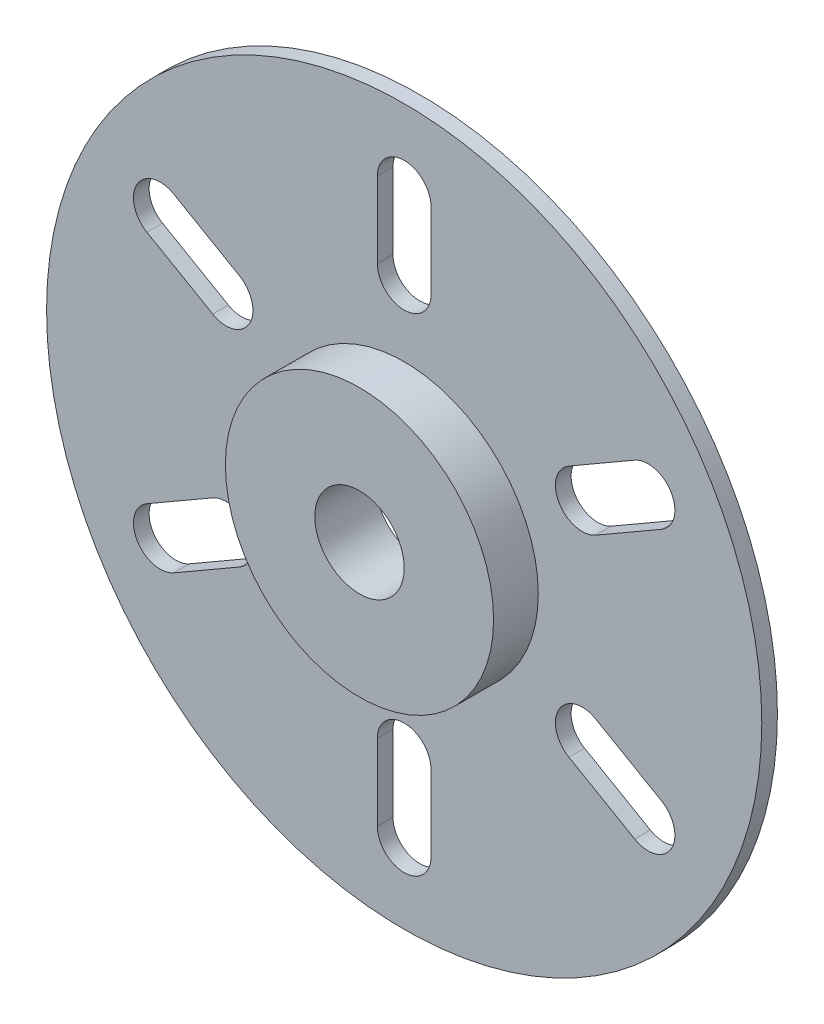
ISO-10303-21;
HEADER;
FILE_DESCRIPTION(('STEP AP214'),'2;1');
FILE_NAME('part.step','',(''),(''),'','','');
FILE_SCHEMA(('AUTOMOTIVE_DESIGN { 1 0 10303 214 1 1 1 1 }'));
ENDSEC;
DATA;
#1=APPLICATION_CONTEXT('core data for automotive mechanical design processes');
#2=APPLICATION_PROTOCOL_DEFINITION('international standard','automotive_design',2000,#1);
#3=PRODUCT_CONTEXT('',#1,'mechanical');
#4=PRODUCT('Part','Part','',(#3));
#5=PRODUCT_RELATED_PRODUCT_CATEGORY('part','',(#4));
#6=PRODUCT_DEFINITION_FORMATION('','',#4);
#7=PRODUCT_DEFINITION_CONTEXT('part definition',#1,'design');
#8=PRODUCT_DEFINITION('design','',#6,#7);
#9=PRODUCT_DEFINITION_SHAPE('','',#8);
#10=(LENGTH_UNIT() NAMED_UNIT(*) SI_UNIT(.MILLI.,.METRE.));
#11=(NAMED_UNIT(*) PLANE_ANGLE_UNIT() SI_UNIT($,.RADIAN.));
#12=(NAMED_UNIT(*) SI_UNIT($,.STERADIAN.) SOLID_ANGLE_UNIT());
#13=UNCERTAINTY_MEASURE_WITH_UNIT(LENGTH_MEASURE(1.E-05),#10,'distance_accuracy_value','');
#14=(GEOMETRIC_REPRESENTATION_CONTEXT(3) GLOBAL_UNCERTAINTY_ASSIGNED_CONTEXT((#13)) GLOBAL_UNIT_ASSIGNED_CONTEXT((#10,
#11,#12)) REPRESENTATION_CONTEXT('',''));
#15=CARTESIAN_POINT('',(0.,0.,0.));
#16=DIRECTION('',(0.,0.,1.));
#17=DIRECTION('',(1.,0.,0.));
#18=AXIS2_PLACEMENT_3D('',#15,#16,#17);
#19=CARTESIAN_POINT('',(0.,0.,3.5));
#20=DIRECTION('',(0.,0.,1.));
#21=DIRECTION('',(1.,0.,0.));
#22=AXIS2_PLACEMENT_3D('',#19,#20,#21);
#23=PLANE('',#22);
#24=CARTESIAN_POINT('',(0.,46.,3.5));
#25=DIRECTION('',(0.,0.,1.));
#26=DIRECTION('',(1.,0.,0.));
#27=AXIS2_PLACEMENT_3D('',#24,#25,#26);
#28=CIRCLE('',#27,6.);
#29=CARTESIAN_POINT('',(-6.,46.,3.5));
#30=VERTEX_POINT('',#29);
#31=CARTESIAN_POINT('',(6.,46.,3.5));
#32=VERTEX_POINT('',#31);
#33=EDGE_CURVE('E51',#30,#32,#28,.T.);
#34=ORIENTED_EDGE('',*,*,#33,.F.);
#35=DIRECTION('',(0.,-1.,0.));
#36=VECTOR('',#35,1.);
#37=CARTESIAN_POINT('',(-6.,46.,3.5));
#38=LINE('',#37,#36);
#39=CARTESIAN_POINT('',(-6.,63.,3.5));
#40=VERTEX_POINT('',#39);
#41=EDGE_CURVE('E340',#40,#30,#38,.T.);
#42=ORIENTED_EDGE('',*,*,#41,.F.);
#43=CARTESIAN_POINT('',(0.,63.,3.5));
#44=DIRECTION('',(0.,0.,1.));
#45=DIRECTION('',(1.,0.,0.));
#46=AXIS2_PLACEMENT_3D('',#43,#44,#45);
#47=CIRCLE('',#46,6.);
#48=CARTESIAN_POINT('',(6.,63.,3.5));
#49=VERTEX_POINT('',#48);
#50=EDGE_CURVE('E354',#49,#40,#47,.T.);
#51=ORIENTED_EDGE('',*,*,#50,.F.);
#52=DIRECTION('',(0.,1.,0.));
#53=VECTOR('',#52,1.);
#54=CARTESIAN_POINT('',(6.,46.,3.5));
#55=LINE('',#54,#53);
#56=EDGE_CURVE('E351',#32,#49,#55,.T.);
#57=ORIENTED_EDGE('',*,*,#56,.F.);
#58=EDGE_LOOP('',(#34,#42,#51,#57));
#59=FACE_BOUND('',#58,.T.);
#60=CARTESIAN_POINT('',(-39.8371685740842,22.9999999999999,3.5));
#61=DIRECTION('',(0.,0.,1.));
#62=DIRECTION('',(1.,0.,0.));
#63=AXIS2_PLACEMENT_3D('',#60,#61,#62);
#64=CIRCLE('',#63,6.);
#65=CARTESIAN_POINT('',(-42.8371685740842,17.8038475772933,3.5));
#66=VERTEX_POINT('',#65);
#67=CARTESIAN_POINT('',(-36.8371685740843,28.1961524227065,3.5));
#68=VERTEX_POINT('',#67);
#69=EDGE_CURVE('E59',#66,#68,#64,.T.);
#70=ORIENTED_EDGE('',*,*,#69,.F.);
#71=DIRECTION('',(0.86602540378444,-0.499999999999997,0.));
#72=VECTOR('',#71,1.);
#73=CARTESIAN_POINT('',(-42.8371685740842,17.8038475772933,3.5));
#74=LINE('',#73,#72);
#75=CARTESIAN_POINT('',(-57.5596004384197,26.3038475772932,3.5));
#76=VERTEX_POINT('',#75);
#77=EDGE_CURVE('E310',#76,#66,#74,.T.);
#78=ORIENTED_EDGE('',*,*,#77,.F.);
#79=CARTESIAN_POINT('',(-54.5596004384197,31.4999999999999,3.5));
#80=DIRECTION('',(0.,0.,1.));
#81=DIRECTION('',(1.,0.,0.));
#82=AXIS2_PLACEMENT_3D('',#79,#80,#81);
#83=CIRCLE('',#82,6.00000000000001);
#84=CARTESIAN_POINT('',(-51.5596004384197,36.6961524227065,3.5));
#85=VERTEX_POINT('',#84);
#86=EDGE_CURVE('E325',#85,#76,#83,.T.);
#87=ORIENTED_EDGE('',*,*,#86,.F.);
#88=DIRECTION('',(-0.866025403784439,0.499999999999999,0.));
#89=VECTOR('',#88,1.);
#90=CARTESIAN_POINT('',(-36.8371685740843,28.1961524227065,3.5));
#91=LINE('',#90,#89);
#92=EDGE_CURVE('E321',#68,#85,#91,.T.);
#93=ORIENTED_EDGE('',*,*,#92,.F.);
#94=EDGE_LOOP('',(#70,#78,#87,#93));
#95=FACE_BOUND('',#94,.T.);
#96=CARTESIAN_POINT('',(-39.8371685740841,-23.0000000000001,3.5));
#97=DIRECTION('',(0.,0.,1.));
#98=DIRECTION('',(1.,0.,0.));
#99=AXIS2_PLACEMENT_3D('',#96,#97,#98);
#100=CIRCLE('',#99,5.99999999999993);
#101=CARTESIAN_POINT('',(-36.8371685740841,-28.1961524227067,3.5));
#102=VERTEX_POINT('',#101);
#103=CARTESIAN_POINT('',(-42.8371685740841,-17.8038475772936,3.5));
#104=VERTEX_POINT('',#103);
#105=EDGE_CURVE('E288',#102,#104,#100,.T.);
#106=ORIENTED_EDGE('',*,*,#105,.F.);
#107=DIRECTION('',(0.866025403784437,0.500000000000003,0.));
#108=VECTOR('',#107,1.);
#109=CARTESIAN_POINT('',(-36.8371685740841,-28.1961524227067,3.5));
#110=LINE('',#109,#108);
#111=CARTESIAN_POINT('',(-51.5596004384195,-36.6961524227068,3.5));
#112=VERTEX_POINT('',#111);
#113=EDGE_CURVE('E278',#112,#102,#110,.T.);
#114=ORIENTED_EDGE('',*,*,#113,.F.);
#115=CARTESIAN_POINT('',(-54.5596004384196,-31.5000000000001,3.5));
#116=DIRECTION('',(0.,0.,1.));
#117=DIRECTION('',(1.,0.,0.));
#118=AXIS2_PLACEMENT_3D('',#115,#116,#117);
#119=CIRCLE('',#118,5.99999999999991);
#120=CARTESIAN_POINT('',(-57.5596004384195,-26.3038475772936,3.5));
#121=VERTEX_POINT('',#120);
#122=EDGE_CURVE('E294',#121,#112,#119,.T.);
#123=ORIENTED_EDGE('',*,*,#122,.F.);
#124=DIRECTION('',(-0.866025403784436,-0.500000000000004,0.));
#125=VECTOR('',#124,1.);
#126=CARTESIAN_POINT('',(-42.8371685740841,-17.8038475772936,3.5));
#127=LINE('',#126,#125);
#128=EDGE_CURVE('E290',#104,#121,#127,.T.);
#129=ORIENTED_EDGE('',*,*,#128,.F.);
#130=EDGE_LOOP('',(#106,#114,#123,#129));
#131=FACE_BOUND('',#130,.T.);
#132=CARTESIAN_POINT('',(0.,-46.,3.5));
#133=DIRECTION('',(0.,0.,1.));
#134=DIRECTION('',(1.,0.,0.));
#135=AXIS2_PLACEMENT_3D('',#132,#133,#134);
#136=CIRCLE('',#135,6.);
#137=CARTESIAN_POINT('',(6.00000000000001,-46.,3.5));
#138=VERTEX_POINT('',#137);
#139=CARTESIAN_POINT('',(-5.99999999999999,-46.,3.5));
#140=VERTEX_POINT('',#139);
#141=EDGE_CURVE('E256',#138,#140,#136,.T.);
#142=ORIENTED_EDGE('',*,*,#141,.F.);
#143=DIRECTION('',(0.,1.,0.));
#144=VECTOR('',#143,1.);
#145=CARTESIAN_POINT('',(6.00000000000001,-46.,3.5));
#146=LINE('',#145,#144);
#147=CARTESIAN_POINT('',(6.00000000000001,-63.,3.5));
#148=VERTEX_POINT('',#147);
#149=EDGE_CURVE('E246',#148,#138,#146,.T.);
#150=ORIENTED_EDGE('',*,*,#149,.F.);
#151=CARTESIAN_POINT('',(0.,-63.,3.5));
#152=DIRECTION('',(0.,0.,1.));
#153=DIRECTION('',(1.,0.,0.));
#154=AXIS2_PLACEMENT_3D('',#151,#152,#153);
#155=CIRCLE('',#154,6.);
#156=CARTESIAN_POINT('',(-5.99999999999999,-63.,3.5));
#157=VERTEX_POINT('',#156);
#158=EDGE_CURVE('E262',#157,#148,#155,.T.);
#159=ORIENTED_EDGE('',*,*,#158,.F.);
#160=DIRECTION('',(0.,-1.,0.));
#161=VECTOR('',#160,1.);
#162=CARTESIAN_POINT('',(-5.99999999999999,-46.,3.5));
#163=LINE('',#162,#161);
#164=EDGE_CURVE('E258',#140,#157,#163,.T.);
#165=ORIENTED_EDGE('',*,*,#164,.F.);
#166=EDGE_LOOP('',(#142,#150,#159,#165));
#167=FACE_BOUND('',#166,.T.);
#168=CARTESIAN_POINT('',(39.8371685740842,-22.9999999999999,3.5));
#169=DIRECTION('',(0.,0.,1.));
#170=DIRECTION('',(1.,0.,0.));
#171=AXIS2_PLACEMENT_3D('',#168,#169,#170);
#172=CIRCLE('',#171,6.00000000000001);
#173=CARTESIAN_POINT('',(42.8371685740842,-17.8038475772933,3.5));
#174=VERTEX_POINT('',#173);
#175=CARTESIAN_POINT('',(36.8371685740843,-28.1961524227065,3.5));
#176=VERTEX_POINT('',#175);
#177=EDGE_CURVE('E204',#174,#176,#172,.T.);
#178=ORIENTED_EDGE('',*,*,#177,.F.);
#179=DIRECTION('',(-0.86602540378444,0.499999999999998,0.));
#180=VECTOR('',#179,1.);
#181=CARTESIAN_POINT('',(42.8371685740842,-17.8038475772933,3.5));
#182=LINE('',#181,#180);
#183=CARTESIAN_POINT('',(57.5596004384197,-26.3038475772932,3.5));
#184=VERTEX_POINT('',#183);
#185=EDGE_CURVE('E222',#184,#174,#182,.T.);
#186=ORIENTED_EDGE('',*,*,#185,.F.);
#187=CARTESIAN_POINT('',(54.5596004384197,-31.4999999999999,3.5));
#188=DIRECTION('',(0.,0.,1.));
#189=DIRECTION('',(1.,0.,0.));
#190=AXIS2_PLACEMENT_3D('',#187,#188,#189);
#191=CIRCLE('',#190,6.);
#192=CARTESIAN_POINT('',(51.5596004384197,-36.6961524227065,3.5));
#193=VERTEX_POINT('',#192);
#194=EDGE_CURVE('E225',#193,#184,#191,.T.);
#195=ORIENTED_EDGE('',*,*,#194,.F.);
#196=DIRECTION('',(0.86602540378444,-0.499999999999997,0.));
#197=VECTOR('',#196,1.);
#198=CARTESIAN_POINT('',(36.8371685740843,-28.1961524227065,3.5));
#199=LINE('',#198,#197);
#200=EDGE_CURVE('E231',#176,#193,#199,.T.);
#201=ORIENTED_EDGE('',*,*,#200,.F.);
#202=EDGE_LOOP('',(#178,#186,#195,#201));
#203=FACE_BOUND('',#202,.T.);
#204=CARTESIAN_POINT('',(39.8371685740841,23.0000000000002,3.5));
#205=DIRECTION('',(0.,0.,1.));
#206=DIRECTION('',(1.,0.,0.));
#207=AXIS2_PLACEMENT_3D('',#204,#205,#206);
#208=CIRCLE('',#207,6.00000000000001);
#209=CARTESIAN_POINT('',(36.837168574084,28.1961524227068,3.5));
#210=VERTEX_POINT('',#209);
#211=CARTESIAN_POINT('',(42.8371685740841,17.8038475772936,3.5));
#212=VERTEX_POINT('',#211);
#213=EDGE_CURVE('E238',#210,#212,#208,.T.);
#214=ORIENTED_EDGE('',*,*,#213,.F.);
#215=DIRECTION('',(-0.866025403784436,-0.500000000000004,0.));
#216=VECTOR('',#215,1.);
#217=CARTESIAN_POINT('',(36.837168574084,28.1961524227068,3.5));
#218=LINE('',#217,#216);
#219=CARTESIAN_POINT('',(51.5596004384194,36.6961524227069,3.5));
#220=VERTEX_POINT('',#219);
#221=EDGE_CURVE('E369',#220,#210,#218,.T.);
#222=ORIENTED_EDGE('',*,*,#221,.F.);
#223=CARTESIAN_POINT('',(54.5596004384195,31.5000000000003,3.5));
#224=DIRECTION('',(0.,0.,1.));
#225=DIRECTION('',(1.,0.,0.));
#226=AXIS2_PLACEMENT_3D('',#223,#224,#225);
#227=CIRCLE('',#226,5.99999999999999);
#228=CARTESIAN_POINT('',(57.5596004384195,26.3038475772937,3.5));
#229=VERTEX_POINT('',#228);
#230=EDGE_CURVE('E383',#229,#220,#227,.T.);
#231=ORIENTED_EDGE('',*,*,#230,.F.);
#232=DIRECTION('',(0.866025403784436,0.500000000000005,0.));
#233=VECTOR('',#232,1.);
#234=CARTESIAN_POINT('',(42.8371685740841,17.8038475772936,3.5));
#235=LINE('',#234,#233);
#236=EDGE_CURVE('E380',#212,#229,#235,.T.);
#237=ORIENTED_EDGE('',*,*,#236,.F.);
#238=EDGE_LOOP('',(#214,#222,#231,#237));
#239=FACE_BOUND('',#238,.T.);
#240=CARTESIAN_POINT('',(0.,0.,3.5));
#241=DIRECTION('',(0.,0.,1.));
#242=DIRECTION('',(1.,0.,0.));
#243=AXIS2_PLACEMENT_3D('',#240,#241,#242);
#244=CIRCLE('',#243,80.);
#245=CARTESIAN_POINT('',(80.,0.,3.5));
#246=VERTEX_POINT('',#245);
#247=EDGE_CURVE('E11',#246,#246,#244,.T.);
#248=ORIENTED_EDGE('',*,*,#247,.T.);
#249=EDGE_LOOP('',(#248));
#250=FACE_BOUND('',#249,.T.);
#251=CARTESIAN_POINT('',(0.,0.,3.5));
#252=DIRECTION('',(0.,0.,1.));
#253=DIRECTION('',(1.,0.,0.));
#254=AXIS2_PLACEMENT_3D('',#251,#252,#253);
#255=CIRCLE('',#254,30.);
#256=CARTESIAN_POINT('',(30.,0.,3.5));
#257=VERTEX_POINT('',#256);
#258=EDGE_CURVE('E399',#257,#257,#255,.T.);
#259=ORIENTED_EDGE('',*,*,#258,.F.);
#260=EDGE_LOOP('',(#259));
#261=FACE_BOUND('',#260,.T.);
#262=ADVANCED_FACE('F36',(#59,#95,#131,#167,#203,#239,#250,#261),#23,.T.);
#263=CARTESIAN_POINT('',(0.,0.,3.5));
#264=DIRECTION('',(0.,0.,-1.));
#265=DIRECTION('',(-1.,0.,0.));
#266=AXIS2_PLACEMENT_3D('',#263,#264,#265);
#267=CYLINDRICAL_SURFACE('',#266,80.);
#268=ORIENTED_EDGE('',*,*,#247,.F.);
#269=EDGE_LOOP('',(#268));
#270=FACE_BOUND('',#269,.T.);
#271=CARTESIAN_POINT('',(0.,0.,0.));
#272=DIRECTION('',(0.,0.,1.));
#273=DIRECTION('',(1.,0.,0.));
#274=AXIS2_PLACEMENT_3D('',#271,#272,#273);
#275=CIRCLE('',#274,80.);
#276=CARTESIAN_POINT('',(80.,0.,0.));
#277=VERTEX_POINT('',#276);
#278=EDGE_CURVE('E40',#277,#277,#275,.T.);
#279=ORIENTED_EDGE('',*,*,#278,.T.);
#280=EDGE_LOOP('',(#279));
#281=FACE_BOUND('',#280,.T.);
#282=ADVANCED_FACE('F38',(#270,#281),#267,.T.);
#283=CARTESIAN_POINT('',(0.,0.,0.));
#284=DIRECTION('',(0.,0.,1.));
#285=DIRECTION('',(1.,0.,0.));
#286=AXIS2_PLACEMENT_3D('',#283,#284,#285);
#287=PLANE('',#286);
#288=DIRECTION('',(0.,-1.,0.));
#289=VECTOR('',#288,1.);
#290=CARTESIAN_POINT('',(-6.,46.,0.));
#291=LINE('',#290,#289);
#292=CARTESIAN_POINT('',(-6.,63.,0.));
#293=VERTEX_POINT('',#292);
#294=CARTESIAN_POINT('',(-6.,46.,0.));
#295=VERTEX_POINT('',#294);
#296=EDGE_CURVE('E346',#293,#295,#291,.T.);
#297=ORIENTED_EDGE('',*,*,#296,.T.);
#298=CARTESIAN_POINT('',(0.,46.,0.));
#299=DIRECTION('',(0.,0.,1.));
#300=DIRECTION('',(1.,0.,0.));
#301=AXIS2_PLACEMENT_3D('',#298,#299,#300);
#302=CIRCLE('',#301,6.);
#303=CARTESIAN_POINT('',(6.,46.,0.));
#304=VERTEX_POINT('',#303);
#305=EDGE_CURVE('E336',#295,#304,#302,.T.);
#306=ORIENTED_EDGE('',*,*,#305,.T.);
#307=DIRECTION('',(0.,1.,0.));
#308=VECTOR('',#307,1.);
#309=CARTESIAN_POINT('',(6.,46.,0.));
#310=LINE('',#309,#308);
#311=CARTESIAN_POINT('',(6.,63.,0.));
#312=VERTEX_POINT('',#311);
#313=EDGE_CURVE('E339',#304,#312,#310,.T.);
#314=ORIENTED_EDGE('',*,*,#313,.T.);
#315=CARTESIAN_POINT('',(0.,63.,0.));
#316=DIRECTION('',(0.,0.,1.));
#317=DIRECTION('',(1.,0.,0.));
#318=AXIS2_PLACEMENT_3D('',#315,#316,#317);
#319=CIRCLE('',#318,6.);
#320=EDGE_CURVE('E343',#312,#293,#319,.T.);
#321=ORIENTED_EDGE('',*,*,#320,.T.);
#322=EDGE_LOOP('',(#297,#306,#314,#321));
#323=FACE_BOUND('',#322,.T.);
#324=DIRECTION('',(0.86602540378444,-0.499999999999997,0.));
#325=VECTOR('',#324,1.);
#326=CARTESIAN_POINT('',(-42.8371685740842,17.8038475772933,0.));
#327=LINE('',#326,#325);
#328=CARTESIAN_POINT('',(-57.5596004384197,26.3038475772932,0.));
#329=VERTEX_POINT('',#328);
#330=CARTESIAN_POINT('',(-42.8371685740842,17.8038475772933,0.));
#331=VERTEX_POINT('',#330);
#332=EDGE_CURVE('E316',#329,#331,#327,.T.);
#333=ORIENTED_EDGE('',*,*,#332,.T.);
#334=CARTESIAN_POINT('',(-39.8371685740842,22.9999999999999,0.));
#335=DIRECTION('',(0.,0.,1.));
#336=DIRECTION('',(1.,0.,0.));
#337=AXIS2_PLACEMENT_3D('',#334,#335,#336);
#338=CIRCLE('',#337,6.);
#339=CARTESIAN_POINT('',(-36.8371685740843,28.1961524227065,0.));
#340=VERTEX_POINT('',#339);
#341=EDGE_CURVE('E306',#331,#340,#338,.T.);
#342=ORIENTED_EDGE('',*,*,#341,.T.);
#343=DIRECTION('',(-0.866025403784439,0.499999999999999,0.));
#344=VECTOR('',#343,1.);
#345=CARTESIAN_POINT('',(-36.8371685740843,28.1961524227065,0.));
#346=LINE('',#345,#344);
#347=CARTESIAN_POINT('',(-51.5596004384197,36.6961524227065,0.));
#348=VERTEX_POINT('',#347);
#349=EDGE_CURVE('E309',#340,#348,#346,.T.);
#350=ORIENTED_EDGE('',*,*,#349,.T.);
#351=CARTESIAN_POINT('',(-54.5596004384197,31.4999999999999,0.));
#352=DIRECTION('',(0.,0.,1.));
#353=DIRECTION('',(1.,0.,0.));
#354=AXIS2_PLACEMENT_3D('',#351,#352,#353);
#355=CIRCLE('',#354,6.00000000000001);
#356=EDGE_CURVE('E313',#348,#329,#355,.T.);
#357=ORIENTED_EDGE('',*,*,#356,.T.);
#358=EDGE_LOOP('',(#333,#342,#350,#357));
#359=FACE_BOUND('',#358,.T.);
#360=DIRECTION('',(0.866025403784437,0.500000000000003,0.));
#361=VECTOR('',#360,1.);
#362=CARTESIAN_POINT('',(-36.8371685740841,-28.1961524227067,0.));
#363=LINE('',#362,#361);
#364=CARTESIAN_POINT('',(-51.5596004384195,-36.6961524227068,0.));
#365=VERTEX_POINT('',#364);
#366=CARTESIAN_POINT('',(-36.8371685740841,-28.1961524227067,0.));
#367=VERTEX_POINT('',#366);
#368=EDGE_CURVE('E284',#365,#367,#363,.T.);
#369=ORIENTED_EDGE('',*,*,#368,.T.);
#370=CARTESIAN_POINT('',(-39.8371685740841,-23.0000000000001,0.));
#371=DIRECTION('',(0.,0.,1.));
#372=DIRECTION('',(1.,0.,0.));
#373=AXIS2_PLACEMENT_3D('',#370,#371,#372);
#374=CIRCLE('',#373,5.99999999999993);
#375=CARTESIAN_POINT('',(-42.8371685740841,-17.8038475772936,0.));
#376=VERTEX_POINT('',#375);
#377=EDGE_CURVE('E274',#367,#376,#374,.T.);
#378=ORIENTED_EDGE('',*,*,#377,.T.);
#379=DIRECTION('',(-0.866025403784436,-0.500000000000004,0.));
#380=VECTOR('',#379,1.);
#381=CARTESIAN_POINT('',(-42.8371685740841,-17.8038475772936,0.));
#382=LINE('',#381,#380);
#383=CARTESIAN_POINT('',(-57.5596004384195,-26.3038475772937,0.));
#384=VERTEX_POINT('',#383);
#385=EDGE_CURVE('E277',#376,#384,#382,.T.);
#386=ORIENTED_EDGE('',*,*,#385,.T.);
#387=CARTESIAN_POINT('',(-54.5596004384196,-31.5000000000001,0.));
#388=DIRECTION('',(0.,0.,1.));
#389=DIRECTION('',(1.,0.,0.));
#390=AXIS2_PLACEMENT_3D('',#387,#388,#389);
#391=CIRCLE('',#390,5.99999999999991);
#392=EDGE_CURVE('E281',#384,#365,#391,.T.);
#393=ORIENTED_EDGE('',*,*,#392,.T.);
#394=EDGE_LOOP('',(#369,#378,#386,#393));
#395=FACE_BOUND('',#394,.T.);
#396=DIRECTION('',(0.,1.,0.));
#397=VECTOR('',#396,1.);
#398=CARTESIAN_POINT('',(6.00000000000001,-46.,0.));
#399=LINE('',#398,#397);
#400=CARTESIAN_POINT('',(6.00000000000001,-63.,0.));
#401=VERTEX_POINT('',#400);
#402=CARTESIAN_POINT('',(6.00000000000001,-46.,0.));
#403=VERTEX_POINT('',#402);
#404=EDGE_CURVE('E252',#401,#403,#399,.T.);
#405=ORIENTED_EDGE('',*,*,#404,.T.);
#406=CARTESIAN_POINT('',(0.,-46.,0.));
#407=DIRECTION('',(0.,0.,1.));
#408=DIRECTION('',(1.,0.,0.));
#409=AXIS2_PLACEMENT_3D('',#406,#407,#408);
#410=CIRCLE('',#409,6.);
#411=CARTESIAN_POINT('',(-5.99999999999999,-46.,0.));
#412=VERTEX_POINT('',#411);
#413=EDGE_CURVE('E242',#403,#412,#410,.T.);
#414=ORIENTED_EDGE('',*,*,#413,.T.);
#415=DIRECTION('',(0.,-1.,0.));
#416=VECTOR('',#415,1.);
#417=CARTESIAN_POINT('',(-5.99999999999999,-46.,0.));
#418=LINE('',#417,#416);
#419=CARTESIAN_POINT('',(-5.99999999999999,-63.,0.));
#420=VERTEX_POINT('',#419);
#421=EDGE_CURVE('E245',#412,#420,#418,.T.);
#422=ORIENTED_EDGE('',*,*,#421,.T.);
#423=CARTESIAN_POINT('',(0.,-63.,0.));
#424=DIRECTION('',(0.,0.,1.));
#425=DIRECTION('',(1.,0.,0.));
#426=AXIS2_PLACEMENT_3D('',#423,#424,#425);
#427=CIRCLE('',#426,6.);
#428=EDGE_CURVE('E249',#420,#401,#427,.T.);
#429=ORIENTED_EDGE('',*,*,#428,.T.);
#430=EDGE_LOOP('',(#405,#414,#422,#429));
#431=FACE_BOUND('',#430,.T.);
#432=DIRECTION('',(-0.86602540378444,0.499999999999998,0.));
#433=VECTOR('',#432,1.);
#434=CARTESIAN_POINT('',(42.8371685740842,-17.8038475772933,0.));
#435=LINE('',#434,#433);
#436=CARTESIAN_POINT('',(57.5596004384197,-26.3038475772932,0.));
#437=VERTEX_POINT('',#436);
#438=CARTESIAN_POINT('',(42.8371685740842,-17.8038475772933,0.));
#439=VERTEX_POINT('',#438);
#440=EDGE_CURVE('E209',#437,#439,#435,.T.);
#441=ORIENTED_EDGE('',*,*,#440,.T.);
#442=CARTESIAN_POINT('',(39.8371685740842,-22.9999999999999,0.));
#443=DIRECTION('',(0.,0.,1.));
#444=DIRECTION('',(1.,0.,0.));
#445=AXIS2_PLACEMENT_3D('',#442,#443,#444);
#446=CIRCLE('',#445,6.00000000000001);
#447=CARTESIAN_POINT('',(36.8371685740843,-28.1961524227065,0.));
#448=VERTEX_POINT('',#447);
#449=EDGE_CURVE('E201',#439,#448,#446,.T.);
#450=ORIENTED_EDGE('',*,*,#449,.T.);
#451=DIRECTION('',(0.86602540378444,-0.499999999999997,0.));
#452=VECTOR('',#451,1.);
#453=CARTESIAN_POINT('',(36.8371685740843,-28.1961524227065,0.));
#454=LINE('',#453,#452);
#455=CARTESIAN_POINT('',(51.5596004384198,-36.6961524227065,0.));
#456=VERTEX_POINT('',#455);
#457=EDGE_CURVE('E213',#448,#456,#454,.T.);
#458=ORIENTED_EDGE('',*,*,#457,.T.);
#459=CARTESIAN_POINT('',(54.5596004384197,-31.4999999999999,0.));
#460=DIRECTION('',(0.,0.,1.));
#461=DIRECTION('',(1.,0.,0.));
#462=AXIS2_PLACEMENT_3D('',#459,#460,#461);
#463=CIRCLE('',#462,6.);
#464=EDGE_CURVE('E217',#456,#437,#463,.T.);
#465=ORIENTED_EDGE('',*,*,#464,.T.);
#466=EDGE_LOOP('',(#441,#450,#458,#465));
#467=FACE_BOUND('',#466,.T.);
#468=DIRECTION('',(-0.866025403784436,-0.500000000000004,0.));
#469=VECTOR('',#468,1.);
#470=CARTESIAN_POINT('',(36.837168574084,28.1961524227068,0.));
#471=LINE('',#470,#469);
#472=CARTESIAN_POINT('',(51.5596004384194,36.6961524227069,0.));
#473=VERTEX_POINT('',#472);
#474=CARTESIAN_POINT('',(36.837168574084,28.1961524227068,0.));
#475=VERTEX_POINT('',#474);
#476=EDGE_CURVE('E375',#473,#475,#471,.T.);
#477=ORIENTED_EDGE('',*,*,#476,.T.);
#478=CARTESIAN_POINT('',(39.8371685740841,23.0000000000002,0.));
#479=DIRECTION('',(0.,0.,1.));
#480=DIRECTION('',(1.,0.,0.));
#481=AXIS2_PLACEMENT_3D('',#478,#479,#480);
#482=CIRCLE('',#481,6.00000000000001);
#483=CARTESIAN_POINT('',(42.8371685740841,17.8038475772936,0.));
#484=VERTEX_POINT('',#483);
#485=EDGE_CURVE('E365',#475,#484,#482,.T.);
#486=ORIENTED_EDGE('',*,*,#485,.T.);
#487=DIRECTION('',(0.866025403784436,0.500000000000005,0.));
#488=VECTOR('',#487,1.);
#489=CARTESIAN_POINT('',(42.8371685740841,17.8038475772936,0.));
#490=LINE('',#489,#488);
#491=CARTESIAN_POINT('',(57.5596004384195,26.3038475772937,0.));
#492=VERTEX_POINT('',#491);
#493=EDGE_CURVE('E368',#484,#492,#490,.T.);
#494=ORIENTED_EDGE('',*,*,#493,.T.);
#495=CARTESIAN_POINT('',(54.5596004384195,31.5000000000003,0.));
#496=DIRECTION('',(0.,0.,1.));
#497=DIRECTION('',(1.,0.,0.));
#498=AXIS2_PLACEMENT_3D('',#495,#496,#497);
#499=CIRCLE('',#498,5.99999999999999);
#500=EDGE_CURVE('E372',#492,#473,#499,.T.);
#501=ORIENTED_EDGE('',*,*,#500,.T.);
#502=EDGE_LOOP('',(#477,#486,#494,#501));
#503=FACE_BOUND('',#502,.T.);
#504=CARTESIAN_POINT('',(0.,0.,0.));
#505=DIRECTION('',(0.,0.,1.));
#506=DIRECTION('',(1.,0.,0.));
#507=AXIS2_PLACEMENT_3D('',#504,#505,#506);
#508=CIRCLE('',#507,10.);
#509=CARTESIAN_POINT('',(10.,0.,0.));
#510=VERTEX_POINT('',#509);
#511=EDGE_CURVE('E403',#510,#510,#508,.T.);
#512=ORIENTED_EDGE('',*,*,#511,.T.);
#513=EDGE_LOOP('',(#512));
#514=FACE_BOUND('',#513,.T.);
#515=ORIENTED_EDGE('',*,*,#278,.F.);
#516=EDGE_LOOP('',(#515));
#517=FACE_BOUND('',#516,.T.);
#518=ADVANCED_FACE('F219',(#323,#359,#395,#431,#467,#503,#514,#517),#287,.F.);
#519=CARTESIAN_POINT('',(0.,0.,0.));
#520=DIRECTION('',(0.,0.,1.));
#521=DIRECTION('',(1.,0.,0.));
#522=AXIS2_PLACEMENT_3D('',#519,#520,#521);
#523=CYLINDRICAL_SURFACE('',#522,10.);
#524=ORIENTED_EDGE('',*,*,#511,.F.);
#525=EDGE_LOOP('',(#524));
#526=FACE_BOUND('',#525,.T.);
#527=CARTESIAN_POINT('',(0.,0.,13.5));
#528=DIRECTION('',(0.,0.,1.));
#529=DIRECTION('',(1.,0.,0.));
#530=AXIS2_PLACEMENT_3D('',#527,#528,#529);
#531=CIRCLE('',#530,10.);
#532=CARTESIAN_POINT('',(10.,0.,13.5));
#533=VERTEX_POINT('',#532);
#534=EDGE_CURVE('E390',#533,#533,#531,.T.);
#535=ORIENTED_EDGE('',*,*,#534,.T.);
#536=EDGE_LOOP('',(#535));
#537=FACE_BOUND('',#536,.T.);
#538=ADVANCED_FACE('F414',(#526,#537),#523,.F.);
#539=CARTESIAN_POINT('',(0.,0.,13.5));
#540=DIRECTION('',(0.,0.,1.));
#541=DIRECTION('',(1.,0.,0.));
#542=AXIS2_PLACEMENT_3D('',#539,#540,#541);
#543=PLANE('',#542);
#544=CARTESIAN_POINT('',(0.,0.,13.5));
#545=DIRECTION('',(0.,0.,1.));
#546=DIRECTION('',(1.,0.,0.));
#547=AXIS2_PLACEMENT_3D('',#544,#545,#546);
#548=CIRCLE('',#547,30.);
#549=CARTESIAN_POINT('',(30.,0.,13.5));
#550=VERTEX_POINT('',#549);
#551=EDGE_CURVE('E400',#550,#550,#548,.T.);
#552=ORIENTED_EDGE('',*,*,#551,.T.);
#553=EDGE_LOOP('',(#552));
#554=FACE_BOUND('',#553,.T.);
#555=ORIENTED_EDGE('',*,*,#534,.F.);
#556=EDGE_LOOP('',(#555));
#557=FACE_BOUND('',#556,.T.);
#558=ADVANCED_FACE('F420',(#554,#557),#543,.T.);
#559=CARTESIAN_POINT('',(0.,0.,13.5));
#560=DIRECTION('',(0.,0.,-1.));
#561=DIRECTION('',(-1.,0.,0.));
#562=AXIS2_PLACEMENT_3D('',#559,#560,#561);
#563=CYLINDRICAL_SURFACE('',#562,30.);
#564=ORIENTED_EDGE('',*,*,#551,.F.);
#565=EDGE_LOOP('',(#564));
#566=FACE_BOUND('',#565,.T.);
#567=ORIENTED_EDGE('',*,*,#258,.T.);
#568=EDGE_LOOP('',(#567));
#569=FACE_BOUND('',#568,.T.);
#570=ADVANCED_FACE('F432',(#566,#569),#563,.T.);
#571=CARTESIAN_POINT('',(39.8371685740841,23.0000000000002,0.));
#572=DIRECTION('',(0.,0.,1.));
#573=DIRECTION('',(1.,0.,0.));
#574=AXIS2_PLACEMENT_3D('',#571,#572,#573);
#575=CYLINDRICAL_SURFACE('',#574,6.00000000000001);
#576=ORIENTED_EDGE('',*,*,#213,.T.);
#577=DIRECTION('',(0.,0.,1.));
#578=VECTOR('',#577,1.);
#579=CARTESIAN_POINT('',(42.8371685740841,17.8038475772936,0.));
#580=LINE('',#579,#578);
#581=EDGE_CURVE('E378',#484,#212,#580,.T.);
#582=ORIENTED_EDGE('',*,*,#581,.F.);
#583=ORIENTED_EDGE('',*,*,#485,.F.);
#584=DIRECTION('',(0.,0.,1.));
#585=VECTOR('',#584,1.);
#586=CARTESIAN_POINT('',(36.837168574084,28.1961524227068,0.));
#587=LINE('',#586,#585);
#588=EDGE_CURVE('E388',#475,#210,#587,.T.);
#589=ORIENTED_EDGE('',*,*,#588,.T.);
#590=EDGE_LOOP('',(#576,#582,#583,#589));
#591=FACE_BOUND('',#590,.T.);
#592=ADVANCED_FACE('F435',(#591),#575,.F.);
#593=CARTESIAN_POINT('',(36.837168574084,28.1961524227068,0.));
#594=DIRECTION('',(-0.500000000000004,0.866025403784436,0.));
#595=DIRECTION('',(-0.866025403784436,-0.500000000000004,0.));
#596=AXIS2_PLACEMENT_3D('',#593,#594,#595);
#597=PLANE('',#596);
#598=ORIENTED_EDGE('',*,*,#221,.T.);
#599=ORIENTED_EDGE('',*,*,#588,.F.);
#600=ORIENTED_EDGE('',*,*,#476,.F.);
#601=DIRECTION('',(0.,0.,1.));
#602=VECTOR('',#601,1.);
#603=CARTESIAN_POINT('',(51.5596004384194,36.6961524227069,0.));
#604=LINE('',#603,#602);
#605=EDGE_CURVE('E391',#473,#220,#604,.T.);
#606=ORIENTED_EDGE('',*,*,#605,.T.);
#607=EDGE_LOOP('',(#598,#599,#600,#606));
#608=FACE_BOUND('',#607,.T.);
#609=ADVANCED_FACE('F442',(#608),#597,.F.);
#610=CARTESIAN_POINT('',(54.5596004384195,31.5000000000003,0.));
#611=DIRECTION('',(0.,0.,1.));
#612=DIRECTION('',(1.,0.,0.));
#613=AXIS2_PLACEMENT_3D('',#610,#611,#612);
#614=CYLINDRICAL_SURFACE('',#613,5.99999999999999);
#615=ORIENTED_EDGE('',*,*,#230,.T.);
#616=ORIENTED_EDGE('',*,*,#605,.F.);
#617=ORIENTED_EDGE('',*,*,#500,.F.);
#618=DIRECTION('',(0.,0.,1.));
#619=VECTOR('',#618,1.);
#620=CARTESIAN_POINT('',(57.5596004384195,26.3038475772937,0.));
#621=LINE('',#620,#619);
#622=EDGE_CURVE('E393',#492,#229,#621,.T.);
#623=ORIENTED_EDGE('',*,*,#622,.T.);
#624=EDGE_LOOP('',(#615,#616,#617,#623));
#625=FACE_BOUND('',#624,.T.);
#626=ADVANCED_FACE('F447',(#625),#614,.F.);
#627=CARTESIAN_POINT('',(42.8371685740841,17.8038475772936,0.));
#628=DIRECTION('',(0.500000000000005,-0.866025403784435,0.));
#629=DIRECTION('',(0.866025403784436,0.500000000000005,0.));
#630=AXIS2_PLACEMENT_3D('',#627,#628,#629);
#631=PLANE('',#630);
#632=ORIENTED_EDGE('',*,*,#236,.T.);
#633=ORIENTED_EDGE('',*,*,#622,.F.);
#634=ORIENTED_EDGE('',*,*,#493,.F.);
#635=ORIENTED_EDGE('',*,*,#581,.T.);
#636=EDGE_LOOP('',(#632,#633,#634,#635));
#637=FACE_BOUND('',#636,.T.);
#638=ADVANCED_FACE('F444',(#637),#631,.F.);
#639=CARTESIAN_POINT('',(39.8371685740842,-22.9999999999999,0.));
#640=DIRECTION('',(0.,0.,1.));
#641=DIRECTION('',(1.,0.,0.));
#642=AXIS2_PLACEMENT_3D('',#639,#640,#641);
#643=CYLINDRICAL_SURFACE('',#642,6.00000000000001);
#644=ORIENTED_EDGE('',*,*,#177,.T.);
#645=DIRECTION('',(0.,0.,1.));
#646=VECTOR('',#645,1.);
#647=CARTESIAN_POINT('',(36.8371685740843,-28.1961524227065,0.));
#648=LINE('',#647,#646);
#649=EDGE_CURVE('E197',#448,#176,#648,.T.);
#650=ORIENTED_EDGE('',*,*,#649,.F.);
#651=ORIENTED_EDGE('',*,*,#449,.F.);
#652=DIRECTION('',(0.,0.,1.));
#653=VECTOR('',#652,1.);
#654=CARTESIAN_POINT('',(42.8371685740842,-17.8038475772933,0.));
#655=LINE('',#654,#653);
#656=EDGE_CURVE('E236',#439,#174,#655,.T.);
#657=ORIENTED_EDGE('',*,*,#656,.T.);
#658=EDGE_LOOP('',(#644,#650,#651,#657));
#659=FACE_BOUND('',#658,.T.);
#660=ADVANCED_FACE('F199',(#659),#643,.F.);
#661=CARTESIAN_POINT('',(42.8371685740842,-17.8038475772933,0.));
#662=DIRECTION('',(0.499999999999998,0.86602540378444,0.));
#663=DIRECTION('',(-0.86602540378444,0.499999999999998,0.));
#664=AXIS2_PLACEMENT_3D('',#661,#662,#663);
#665=PLANE('',#664);
#666=ORIENTED_EDGE('',*,*,#185,.T.);
#667=ORIENTED_EDGE('',*,*,#656,.F.);
#668=ORIENTED_EDGE('',*,*,#440,.F.);
#669=DIRECTION('',(0.,0.,1.));
#670=VECTOR('',#669,1.);
#671=CARTESIAN_POINT('',(57.5596004384197,-26.3038475772932,0.));
#672=LINE('',#671,#670);
#673=EDGE_CURVE('E239',#437,#184,#672,.T.);
#674=ORIENTED_EDGE('',*,*,#673,.T.);
#675=EDGE_LOOP('',(#666,#667,#668,#674));
#676=FACE_BOUND('',#675,.T.);
#677=ADVANCED_FACE('F519',(#676),#665,.F.);
#678=CARTESIAN_POINT('',(54.5596004384197,-31.4999999999999,0.));
#679=DIRECTION('',(0.,0.,1.));
#680=DIRECTION('',(1.,0.,0.));
#681=AXIS2_PLACEMENT_3D('',#678,#679,#680);
#682=CYLINDRICAL_SURFACE('',#681,6.);
#683=ORIENTED_EDGE('',*,*,#194,.T.);
#684=ORIENTED_EDGE('',*,*,#673,.F.);
#685=ORIENTED_EDGE('',*,*,#464,.F.);
#686=DIRECTION('',(0.,0.,1.));
#687=VECTOR('',#686,1.);
#688=CARTESIAN_POINT('',(51.5596004384197,-36.6961524227065,0.));
#689=LINE('',#688,#687);
#690=EDGE_CURVE('E208',#456,#193,#689,.T.);
#691=ORIENTED_EDGE('',*,*,#690,.T.);
#692=EDGE_LOOP('',(#683,#684,#685,#691));
#693=FACE_BOUND('',#692,.T.);
#694=ADVANCED_FACE('F522',(#693),#682,.F.);
#695=CARTESIAN_POINT('',(36.8371685740843,-28.1961524227065,0.));
#696=DIRECTION('',(-0.499999999999997,-0.86602540378444,0.));
#697=DIRECTION('',(0.86602540378444,-0.499999999999998,0.));
#698=AXIS2_PLACEMENT_3D('',#695,#696,#697);
#699=PLANE('',#698);
#700=ORIENTED_EDGE('',*,*,#200,.T.);
#701=ORIENTED_EDGE('',*,*,#690,.F.);
#702=ORIENTED_EDGE('',*,*,#457,.F.);
#703=ORIENTED_EDGE('',*,*,#649,.T.);
#704=EDGE_LOOP('',(#700,#701,#702,#703));
#705=FACE_BOUND('',#704,.T.);
#706=ADVANCED_FACE('F214',(#705),#699,.F.);
#707=CARTESIAN_POINT('',(0.,-46.,0.));
#708=DIRECTION('',(0.,0.,1.));
#709=DIRECTION('',(1.,0.,0.));
#710=AXIS2_PLACEMENT_3D('',#707,#708,#709);
#711=CYLINDRICAL_SURFACE('',#710,6.);
#712=ORIENTED_EDGE('',*,*,#141,.T.);
#713=DIRECTION('',(0.,0.,1.));
#714=VECTOR('',#713,1.);
#715=CARTESIAN_POINT('',(-5.99999999999999,-46.,0.));
#716=LINE('',#715,#714);
#717=EDGE_CURVE('E255',#412,#140,#716,.T.);
#718=ORIENTED_EDGE('',*,*,#717,.F.);
#719=ORIENTED_EDGE('',*,*,#413,.F.);
#720=DIRECTION('',(0.,0.,1.));
#721=VECTOR('',#720,1.);
#722=CARTESIAN_POINT('',(6.00000000000001,-46.,0.));
#723=LINE('',#722,#721);
#724=EDGE_CURVE('E232',#403,#138,#723,.T.);
#725=ORIENTED_EDGE('',*,*,#724,.T.);
#726=EDGE_LOOP('',(#712,#718,#719,#725));
#727=FACE_BOUND('',#726,.T.);
#728=ADVANCED_FACE('F502',(#727),#711,.F.);
#729=CARTESIAN_POINT('',(6.00000000000001,-46.,0.));
#730=DIRECTION('',(1.,0.,0.));
#731=DIRECTION('',(0.,1.,0.));
#732=AXIS2_PLACEMENT_3D('',#729,#730,#731);
#733=PLANE('',#732);
#734=ORIENTED_EDGE('',*,*,#149,.T.);
#735=ORIENTED_EDGE('',*,*,#724,.F.);
#736=ORIENTED_EDGE('',*,*,#404,.F.);
#737=DIRECTION('',(0.,0.,1.));
#738=VECTOR('',#737,1.);
#739=CARTESIAN_POINT('',(6.00000000000001,-63.,0.));
#740=LINE('',#739,#738);
#741=EDGE_CURVE('E268',#401,#148,#740,.T.);
#742=ORIENTED_EDGE('',*,*,#741,.T.);
#743=EDGE_LOOP('',(#734,#735,#736,#742));
#744=FACE_BOUND('',#743,.T.);
#745=ADVANCED_FACE('F505',(#744),#733,.F.);
#746=CARTESIAN_POINT('',(0.,-63.,0.));
#747=DIRECTION('',(0.,0.,1.));
#748=DIRECTION('',(1.,0.,0.));
#749=AXIS2_PLACEMENT_3D('',#746,#747,#748);
#750=CYLINDRICAL_SURFACE('',#749,6.);
#751=ORIENTED_EDGE('',*,*,#158,.T.);
#752=ORIENTED_EDGE('',*,*,#741,.F.);
#753=ORIENTED_EDGE('',*,*,#428,.F.);
#754=DIRECTION('',(0.,0.,1.));
#755=VECTOR('',#754,1.);
#756=CARTESIAN_POINT('',(-5.99999999999999,-63.,0.));
#757=LINE('',#756,#755);
#758=EDGE_CURVE('E270',#420,#157,#757,.T.);
#759=ORIENTED_EDGE('',*,*,#758,.T.);
#760=EDGE_LOOP('',(#751,#752,#753,#759));
#761=FACE_BOUND('',#760,.T.);
#762=ADVANCED_FACE('F509',(#761),#750,.F.);
#763=CARTESIAN_POINT('',(-5.99999999999999,-46.,0.));
#764=DIRECTION('',(-1.,0.,0.));
#765=DIRECTION('',(0.,0.,1.));
#766=AXIS2_PLACEMENT_3D('',#763,#764,#765);
#767=PLANE('',#766);
#768=ORIENTED_EDGE('',*,*,#164,.T.);
#769=ORIENTED_EDGE('',*,*,#758,.F.);
#770=ORIENTED_EDGE('',*,*,#421,.F.);
#771=ORIENTED_EDGE('',*,*,#717,.T.);
#772=EDGE_LOOP('',(#768,#769,#770,#771));
#773=FACE_BOUND('',#772,.T.);
#774=ADVANCED_FACE('F490',(#773),#767,.F.);
#775=CARTESIAN_POINT('',(-39.8371685740841,-23.0000000000001,0.));
#776=DIRECTION('',(0.,0.,1.));
#777=DIRECTION('',(1.,0.,0.));
#778=AXIS2_PLACEMENT_3D('',#775,#776,#777);
#779=CYLINDRICAL_SURFACE('',#778,5.99999999999993);
#780=ORIENTED_EDGE('',*,*,#105,.T.);
#781=DIRECTION('',(0.,0.,1.));
#782=VECTOR('',#781,1.);
#783=CARTESIAN_POINT('',(-42.8371685740841,-17.8038475772936,0.));
#784=LINE('',#783,#782);
#785=EDGE_CURVE('E287',#376,#104,#784,.T.);
#786=ORIENTED_EDGE('',*,*,#785,.F.);
#787=ORIENTED_EDGE('',*,*,#377,.F.);
#788=DIRECTION('',(0.,0.,1.));
#789=VECTOR('',#788,1.);
#790=CARTESIAN_POINT('',(-36.8371685740841,-28.1961524227067,0.));
#791=LINE('',#790,#789);
#792=EDGE_CURVE('E259',#367,#102,#791,.T.);
#793=ORIENTED_EDGE('',*,*,#792,.T.);
#794=EDGE_LOOP('',(#780,#786,#787,#793));
#795=FACE_BOUND('',#794,.T.);
#796=ADVANCED_FACE('F486',(#795),#779,.F.);
#797=CARTESIAN_POINT('',(-36.8371685740841,-28.1961524227067,0.));
#798=DIRECTION('',(0.500000000000002,-0.866025403784437,0.));
#799=DIRECTION('',(0.866025403784437,0.500000000000003,0.));
#800=AXIS2_PLACEMENT_3D('',#797,#798,#799);
#801=PLANE('',#800);
#802=ORIENTED_EDGE('',*,*,#113,.T.);
#803=ORIENTED_EDGE('',*,*,#792,.F.);
#804=ORIENTED_EDGE('',*,*,#368,.F.);
#805=DIRECTION('',(0.,0.,1.));
#806=VECTOR('',#805,1.);
#807=CARTESIAN_POINT('',(-51.5596004384195,-36.6961524227068,0.));
#808=LINE('',#807,#806);
#809=EDGE_CURVE('E300',#365,#112,#808,.T.);
#810=ORIENTED_EDGE('',*,*,#809,.T.);
#811=EDGE_LOOP('',(#802,#803,#804,#810));
#812=FACE_BOUND('',#811,.T.);
#813=ADVANCED_FACE('F489',(#812),#801,.F.);
#814=CARTESIAN_POINT('',(-54.5596004384196,-31.5000000000001,0.));
#815=DIRECTION('',(0.,0.,1.));
#816=DIRECTION('',(1.,0.,0.));
#817=AXIS2_PLACEMENT_3D('',#814,#815,#816);
#818=CYLINDRICAL_SURFACE('',#817,5.99999999999991);
#819=ORIENTED_EDGE('',*,*,#122,.T.);
#820=ORIENTED_EDGE('',*,*,#809,.F.);
#821=ORIENTED_EDGE('',*,*,#392,.F.);
#822=DIRECTION('',(0.,0.,1.));
#823=VECTOR('',#822,1.);
#824=CARTESIAN_POINT('',(-57.5596004384195,-26.3038475772936,0.));
#825=LINE('',#824,#823);
#826=EDGE_CURVE('E302',#384,#121,#825,.T.);
#827=ORIENTED_EDGE('',*,*,#826,.T.);
#828=EDGE_LOOP('',(#819,#820,#821,#827));
#829=FACE_BOUND('',#828,.T.);
#830=ADVANCED_FACE('F494',(#829),#818,.F.);
#831=CARTESIAN_POINT('',(-42.8371685740841,-17.8038475772936,0.));
#832=DIRECTION('',(-0.500000000000004,0.866025403784436,0.));
#833=DIRECTION('',(-0.866025403784436,-0.500000000000005,0.));
#834=AXIS2_PLACEMENT_3D('',#831,#832,#833);
#835=PLANE('',#834);
#836=ORIENTED_EDGE('',*,*,#128,.T.);
#837=ORIENTED_EDGE('',*,*,#826,.F.);
#838=ORIENTED_EDGE('',*,*,#385,.F.);
#839=ORIENTED_EDGE('',*,*,#785,.T.);
#840=EDGE_LOOP('',(#836,#837,#838,#839));
#841=FACE_BOUND('',#840,.T.);
#842=ADVANCED_FACE('F475',(#841),#835,.F.);
#843=CARTESIAN_POINT('',(-39.8371685740842,22.9999999999999,0.));
#844=DIRECTION('',(0.,0.,1.));
#845=DIRECTION('',(1.,0.,0.));
#846=AXIS2_PLACEMENT_3D('',#843,#844,#845);
#847=CYLINDRICAL_SURFACE('',#846,6.);
#848=ORIENTED_EDGE('',*,*,#69,.T.);
#849=DIRECTION('',(0.,0.,1.));
#850=VECTOR('',#849,1.);
#851=CARTESIAN_POINT('',(-36.8371685740843,28.1961524227065,0.));
#852=LINE('',#851,#850);
#853=EDGE_CURVE('E319',#340,#68,#852,.T.);
#854=ORIENTED_EDGE('',*,*,#853,.F.);
#855=ORIENTED_EDGE('',*,*,#341,.F.);
#856=DIRECTION('',(0.,0.,1.));
#857=VECTOR('',#856,1.);
#858=CARTESIAN_POINT('',(-42.8371685740842,17.8038475772933,0.));
#859=LINE('',#858,#857);
#860=EDGE_CURVE('E291',#331,#66,#859,.T.);
#861=ORIENTED_EDGE('',*,*,#860,.T.);
#862=EDGE_LOOP('',(#848,#854,#855,#861));
#863=FACE_BOUND('',#862,.T.);
#864=ADVANCED_FACE('F471',(#863),#847,.F.);
#865=CARTESIAN_POINT('',(-42.8371685740842,17.8038475772933,0.));
#866=DIRECTION('',(-0.499999999999997,-0.86602540378444,0.));
#867=DIRECTION('',(0.86602540378444,-0.499999999999997,0.));
#868=AXIS2_PLACEMENT_3D('',#865,#866,#867);
#869=PLANE('',#868);
#870=ORIENTED_EDGE('',*,*,#77,.T.);
#871=ORIENTED_EDGE('',*,*,#860,.F.);
#872=ORIENTED_EDGE('',*,*,#332,.F.);
#873=DIRECTION('',(0.,0.,1.));
#874=VECTOR('',#873,1.);
#875=CARTESIAN_POINT('',(-57.5596004384197,26.3038475772932,0.));
#876=LINE('',#875,#874);
#877=EDGE_CURVE('E331',#329,#76,#876,.T.);
#878=ORIENTED_EDGE('',*,*,#877,.T.);
#879=EDGE_LOOP('',(#870,#871,#872,#878));
#880=FACE_BOUND('',#879,.T.);
#881=ADVANCED_FACE('F474',(#880),#869,.F.);
#882=CARTESIAN_POINT('',(-54.5596004384197,31.4999999999999,0.));
#883=DIRECTION('',(0.,0.,1.));
#884=DIRECTION('',(1.,0.,0.));
#885=AXIS2_PLACEMENT_3D('',#882,#883,#884);
#886=CYLINDRICAL_SURFACE('',#885,6.00000000000001);
#887=ORIENTED_EDGE('',*,*,#86,.T.);
#888=ORIENTED_EDGE('',*,*,#877,.F.);
#889=ORIENTED_EDGE('',*,*,#356,.F.);
#890=DIRECTION('',(0.,0.,1.));
#891=VECTOR('',#890,1.);
#892=CARTESIAN_POINT('',(-51.5596004384197,36.6961524227065,0.));
#893=LINE('',#892,#891);
#894=EDGE_CURVE('E333',#348,#85,#893,.T.);
#895=ORIENTED_EDGE('',*,*,#894,.T.);
#896=EDGE_LOOP('',(#887,#888,#889,#895));
#897=FACE_BOUND('',#896,.T.);
#898=ADVANCED_FACE('F478',(#897),#886,.F.);
#899=CARTESIAN_POINT('',(-36.8371685740843,28.1961524227065,0.));
#900=DIRECTION('',(0.499999999999999,0.866025403784439,0.));
#901=DIRECTION('',(-0.866025403784439,0.499999999999999,0.));
#902=AXIS2_PLACEMENT_3D('',#899,#900,#901);
#903=PLANE('',#902);
#904=ORIENTED_EDGE('',*,*,#92,.T.);
#905=ORIENTED_EDGE('',*,*,#894,.F.);
#906=ORIENTED_EDGE('',*,*,#349,.F.);
#907=ORIENTED_EDGE('',*,*,#853,.T.);
#908=EDGE_LOOP('',(#904,#905,#906,#907));
#909=FACE_BOUND('',#908,.T.);
#910=ADVANCED_FACE('F459',(#909),#903,.F.);
#911=CARTESIAN_POINT('',(0.,46.,0.));
#912=DIRECTION('',(0.,0.,1.));
#913=DIRECTION('',(1.,0.,0.));
#914=AXIS2_PLACEMENT_3D('',#911,#912,#913);
#915=CYLINDRICAL_SURFACE('',#914,6.);
#916=ORIENTED_EDGE('',*,*,#33,.T.);
#917=DIRECTION('',(0.,0.,1.));
#918=VECTOR('',#917,1.);
#919=CARTESIAN_POINT('',(6.,46.,0.));
#920=LINE('',#919,#918);
#921=EDGE_CURVE('E349',#304,#32,#920,.T.);
#922=ORIENTED_EDGE('',*,*,#921,.F.);
#923=ORIENTED_EDGE('',*,*,#305,.F.);
#924=DIRECTION('',(0.,0.,1.));
#925=VECTOR('',#924,1.);
#926=CARTESIAN_POINT('',(-6.,46.,0.));
#927=LINE('',#926,#925);
#928=EDGE_CURVE('E322',#295,#30,#927,.T.);
#929=ORIENTED_EDGE('',*,*,#928,.T.);
#930=EDGE_LOOP('',(#916,#922,#923,#929));
#931=FACE_BOUND('',#930,.T.);
#932=ADVANCED_FACE('F455',(#931),#915,.F.);
#933=CARTESIAN_POINT('',(-6.,46.,0.));
#934=DIRECTION('',(-1.,0.,0.));
#935=DIRECTION('',(0.,0.,1.));
#936=AXIS2_PLACEMENT_3D('',#933,#934,#935);
#937=PLANE('',#936);
#938=ORIENTED_EDGE('',*,*,#41,.T.);
#939=ORIENTED_EDGE('',*,*,#928,.F.);
#940=ORIENTED_EDGE('',*,*,#296,.F.);
#941=DIRECTION('',(0.,0.,1.));
#942=VECTOR('',#941,1.);
#943=CARTESIAN_POINT('',(-6.,63.,0.));
#944=LINE('',#943,#942);
#945=EDGE_CURVE('E360',#293,#40,#944,.T.);
#946=ORIENTED_EDGE('',*,*,#945,.T.);
#947=EDGE_LOOP('',(#938,#939,#940,#946));
#948=FACE_BOUND('',#947,.T.);
#949=ADVANCED_FACE('F458',(#948),#937,.F.);
#950=CARTESIAN_POINT('',(0.,63.,0.));
#951=DIRECTION('',(0.,0.,1.));
#952=DIRECTION('',(1.,0.,0.));
#953=AXIS2_PLACEMENT_3D('',#950,#951,#952);
#954=CYLINDRICAL_SURFACE('',#953,6.);
#955=ORIENTED_EDGE('',*,*,#50,.T.);
#956=ORIENTED_EDGE('',*,*,#945,.F.);
#957=ORIENTED_EDGE('',*,*,#320,.F.);
#958=DIRECTION('',(0.,0.,1.));
#959=VECTOR('',#958,1.);
#960=CARTESIAN_POINT('',(6.,63.,0.));
#961=LINE('',#960,#959);
#962=EDGE_CURVE('E362',#312,#49,#961,.T.);
#963=ORIENTED_EDGE('',*,*,#962,.T.);
#964=EDGE_LOOP('',(#955,#956,#957,#963));
#965=FACE_BOUND('',#964,.T.);
#966=ADVANCED_FACE('F463',(#965),#954,.F.);
#967=CARTESIAN_POINT('',(6.,46.,0.));
#968=DIRECTION('',(1.,0.,0.));
#969=DIRECTION('',(0.,0.,-1.));
#970=AXIS2_PLACEMENT_3D('',#967,#968,#969);
#971=PLANE('',#970);
#972=ORIENTED_EDGE('',*,*,#56,.T.);
#973=ORIENTED_EDGE('',*,*,#962,.F.);
#974=ORIENTED_EDGE('',*,*,#313,.F.);
#975=ORIENTED_EDGE('',*,*,#921,.T.);
#976=EDGE_LOOP('',(#972,#973,#974,#975));
#977=FACE_BOUND('',#976,.T.);
#978=ADVANCED_FACE('F460',(#977),#971,.F.);
#979=CLOSED_SHELL('',(#262,#282,#518,#538,#558,#570,#592,#609,#626,#638,#660,#677,#694,#706,
#728,#745,#762,#774,#796,#813,#830,#842,#864,#881,#898,#910,#932,#949,#966,#978));
#980=MANIFOLD_SOLID_BREP('B2',#979);
#981=ADVANCED_BREP_SHAPE_REPRESENTATION('',(#18,#980),#14);
#982=SHAPE_DEFINITION_REPRESENTATION(#9,#981);
ENDSEC;
END-ISO-10303-21;
